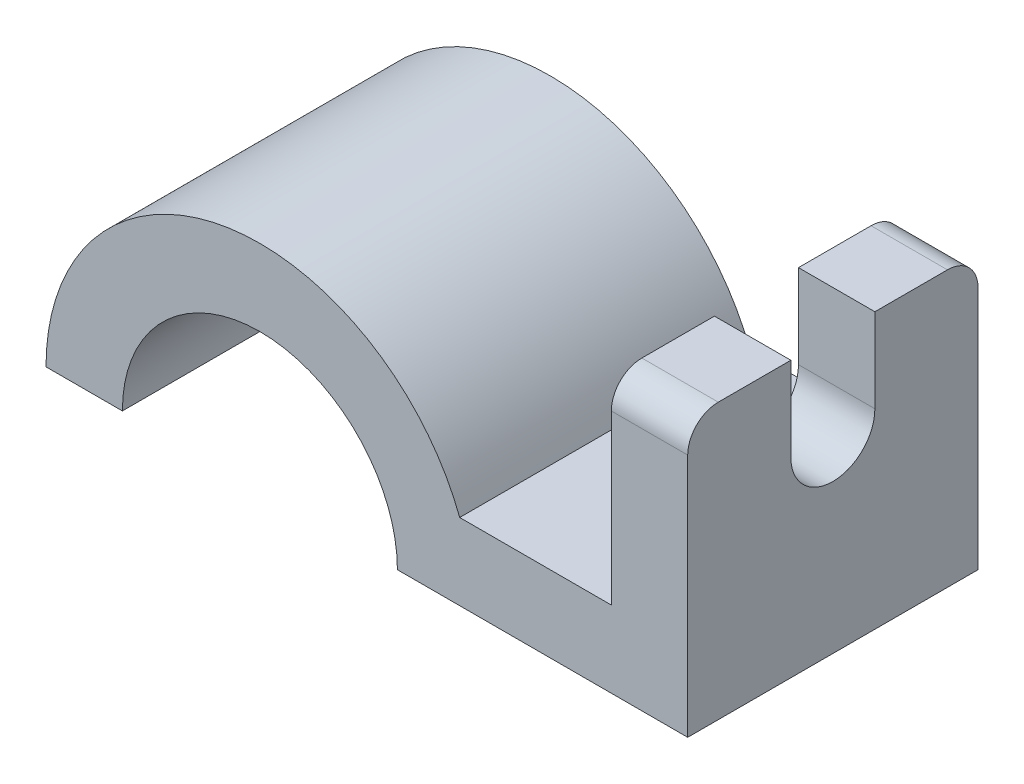
ISO-10303-21;
HEADER;
FILE_DESCRIPTION(('STEP AP214'),'2;1');
FILE_NAME('part.step','',(''),(''),'','','');
FILE_SCHEMA(('AUTOMOTIVE_DESIGN { 1 0 10303 214 1 1 1 1 }'));
ENDSEC;
DATA;
#1=APPLICATION_CONTEXT('core data for automotive mechanical design processes');
#2=APPLICATION_PROTOCOL_DEFINITION('international standard','automotive_design',2000,#1);
#3=PRODUCT_CONTEXT('',#1,'mechanical');
#4=PRODUCT('Part','Part','',(#3));
#5=PRODUCT_RELATED_PRODUCT_CATEGORY('part','',(#4));
#6=PRODUCT_DEFINITION_FORMATION('','',#4);
#7=PRODUCT_DEFINITION_CONTEXT('part definition',#1,'design');
#8=PRODUCT_DEFINITION('design','',#6,#7);
#9=PRODUCT_DEFINITION_SHAPE('','',#8);
#10=(LENGTH_UNIT() NAMED_UNIT(*) SI_UNIT(.MILLI.,.METRE.));
#11=(NAMED_UNIT(*) PLANE_ANGLE_UNIT() SI_UNIT($,.RADIAN.));
#12=(NAMED_UNIT(*) SI_UNIT($,.STERADIAN.) SOLID_ANGLE_UNIT());
#13=UNCERTAINTY_MEASURE_WITH_UNIT(LENGTH_MEASURE(1.E-05),#10,'distance_accuracy_value','');
#14=(GEOMETRIC_REPRESENTATION_CONTEXT(3) GLOBAL_UNCERTAINTY_ASSIGNED_CONTEXT((#13)) GLOBAL_UNIT_ASSIGNED_CONTEXT((#10,
#11,#12)) REPRESENTATION_CONTEXT('',''));
#15=CARTESIAN_POINT('',(0.,0.,0.));
#16=DIRECTION('',(0.,0.,1.));
#17=DIRECTION('',(1.,0.,0.));
#18=AXIS2_PLACEMENT_3D('',#15,#16,#17);
#19=CARTESIAN_POINT('',(0.,25.,-19.));
#20=DIRECTION('',(-1.,0.,0.));
#21=DIRECTION('',(0.,0.,1.));
#22=AXIS2_PLACEMENT_3D('',#19,#20,#21);
#23=PLANE('',#22);
#24=DIRECTION('',(0.,1.,0.));
#25=VECTOR('',#24,1.);
#26=CARTESIAN_POINT('',(0.,0.,-38.));
#27=LINE('',#26,#25);
#28=CARTESIAN_POINT('',(0.,10.,-38.));
#29=VERTEX_POINT('',#28);
#30=CARTESIAN_POINT('',(0.,32.,-38.));
#31=VERTEX_POINT('',#30);
#32=EDGE_CURVE('E181',#29,#31,#27,.T.);
#33=ORIENTED_EDGE('',*,*,#32,.F.);
#34=DIRECTION('',(0.,0.,1.));
#35=VECTOR('',#34,1.);
#36=CARTESIAN_POINT('',(0.,10.,-38.));
#37=LINE('',#36,#35);
#38=CARTESIAN_POINT('',(0.,10.,0.));
#39=VERTEX_POINT('',#38);
#40=EDGE_CURVE('E171',#29,#39,#37,.T.);
#41=ORIENTED_EDGE('',*,*,#40,.T.);
#42=DIRECTION('',(0.,-1.,0.));
#43=VECTOR('',#42,1.);
#44=CARTESIAN_POINT('',(0.,36.,0.));
#45=LINE('',#44,#43);
#46=CARTESIAN_POINT('',(0.,32.,0.));
#47=VERTEX_POINT('',#46);
#48=EDGE_CURVE('E170',#47,#39,#45,.T.);
#49=ORIENTED_EDGE('',*,*,#48,.F.);
#50=CARTESIAN_POINT('',(0.,32.,-4.));
#51=DIRECTION('',(-1.,0.,0.));
#52=DIRECTION('',(0.,0.,1.));
#53=AXIS2_PLACEMENT_3D('',#50,#51,#52);
#54=CIRCLE('',#53,4.);
#55=CARTESIAN_POINT('',(0.,36.,-4.));
#56=VERTEX_POINT('',#55);
#57=EDGE_CURVE('E229',#47,#56,#54,.T.);
#58=ORIENTED_EDGE('',*,*,#57,.T.);
#59=DIRECTION('',(0.,0.,1.));
#60=VECTOR('',#59,1.);
#61=CARTESIAN_POINT('',(0.,36.,-13.5));
#62=LINE('',#61,#60);
#63=CARTESIAN_POINT('',(0.,36.,-13.5));
#64=VERTEX_POINT('',#63);
#65=EDGE_CURVE('E206',#64,#56,#62,.T.);
#66=ORIENTED_EDGE('',*,*,#65,.F.);
#67=DIRECTION('',(0.,1.,0.));
#68=VECTOR('',#67,1.);
#69=CARTESIAN_POINT('',(0.,25.,-13.5));
#70=LINE('',#69,#68);
#71=CARTESIAN_POINT('',(0.,25.,-13.5));
#72=VERTEX_POINT('',#71);
#73=EDGE_CURVE('E204',#72,#64,#70,.T.);
#74=ORIENTED_EDGE('',*,*,#73,.F.);
#75=CARTESIAN_POINT('',(0.,25.,-19.));
#76=DIRECTION('',(-1.,0.,0.));
#77=DIRECTION('',(0.,0.,1.));
#78=AXIS2_PLACEMENT_3D('',#75,#76,#77);
#79=CIRCLE('',#78,5.5);
#80=CARTESIAN_POINT('',(0.,25.,-24.5));
#81=VERTEX_POINT('',#80);
#82=EDGE_CURVE('E202',#81,#72,#79,.T.);
#83=ORIENTED_EDGE('',*,*,#82,.F.);
#84=DIRECTION('',(0.,-1.,0.));
#85=VECTOR('',#84,1.);
#86=CARTESIAN_POINT('',(0.,36.,-24.5));
#87=LINE('',#86,#85);
#88=CARTESIAN_POINT('',(0.,36.,-24.5));
#89=VERTEX_POINT('',#88);
#90=EDGE_CURVE('E191',#89,#81,#87,.T.);
#91=ORIENTED_EDGE('',*,*,#90,.F.);
#92=DIRECTION('',(0.,0.,1.));
#93=VECTOR('',#92,1.);
#94=CARTESIAN_POINT('',(0.,36.,-38.));
#95=LINE('',#94,#93);
#96=CARTESIAN_POINT('',(0.,36.,-34.));
#97=VERTEX_POINT('',#96);
#98=EDGE_CURVE('E189',#97,#89,#95,.T.);
#99=ORIENTED_EDGE('',*,*,#98,.F.);
#100=CARTESIAN_POINT('',(0.,32.,-34.));
#101=DIRECTION('',(-1.,0.,0.));
#102=DIRECTION('',(0.,0.,1.));
#103=AXIS2_PLACEMENT_3D('',#100,#101,#102);
#104=CIRCLE('',#103,4.);
#105=EDGE_CURVE('E187',#97,#31,#104,.T.);
#106=ORIENTED_EDGE('',*,*,#105,.T.);
#107=EDGE_LOOP('',(#33,#41,#49,#58,#66,#74,#83,#91,#99,#106));
#108=FACE_BOUND('',#107,.T.);
#109=ADVANCED_FACE('F31',(#108),#23,.T.);
#110=CARTESIAN_POINT('',(10.,36.,0.));
#111=DIRECTION('',(0.,0.,-1.));
#112=DIRECTION('',(0.,1.,0.));
#113=AXIS2_PLACEMENT_3D('',#110,#111,#112);
#114=PLANE('',#113);
#115=DIRECTION('',(0.,-1.,0.));
#116=VECTOR('',#115,1.);
#117=CARTESIAN_POINT('',(10.,36.,0.));
#118=LINE('',#117,#116);
#119=CARTESIAN_POINT('',(10.,32.,0.));
#120=VERTEX_POINT('',#119);
#121=CARTESIAN_POINT('',(10.,0.,0.));
#122=VERTEX_POINT('',#121);
#123=EDGE_CURVE('E208',#120,#122,#118,.T.);
#124=ORIENTED_EDGE('',*,*,#123,.F.);
#125=DIRECTION('',(-1.,0.,0.));
#126=VECTOR('',#125,1.);
#127=CARTESIAN_POINT('',(10.,32.,0.));
#128=LINE('',#127,#126);
#129=EDGE_CURVE('E40',#120,#47,#128,.T.);
#130=ORIENTED_EDGE('',*,*,#129,.T.);
#131=ORIENTED_EDGE('',*,*,#48,.T.);
#132=DIRECTION('',(-1.,0.,0.));
#133=VECTOR('',#132,1.);
#134=CARTESIAN_POINT('',(0.,10.,0.));
#135=LINE('',#134,#133);
#136=CARTESIAN_POINT('',(-19.846606338756,10.,0.));
#137=VERTEX_POINT('',#136);
#138=EDGE_CURVE('E48',#39,#137,#135,.T.);
#139=ORIENTED_EDGE('',*,*,#138,.T.);
#140=CARTESIAN_POINT('',(-46.,0.,0.));
#141=DIRECTION('',(0.,0.,1.));
#142=DIRECTION('',(1.,0.,0.));
#143=AXIS2_PLACEMENT_3D('',#140,#141,#142);
#144=CIRCLE('',#143,28.);
#145=CARTESIAN_POINT('',(-74.,0.,0.));
#146=VERTEX_POINT('',#145);
#147=EDGE_CURVE('E164',#137,#146,#144,.T.);
#148=ORIENTED_EDGE('',*,*,#147,.T.);
#149=DIRECTION('',(1.,0.,0.));
#150=VECTOR('',#149,1.);
#151=CARTESIAN_POINT('',(-64.,0.,0.));
#152=LINE('',#151,#150);
#153=CARTESIAN_POINT('',(-64.,0.,0.));
#154=VERTEX_POINT('',#153);
#155=EDGE_CURVE('E139',#146,#154,#152,.T.);
#156=ORIENTED_EDGE('',*,*,#155,.T.);
#157=CARTESIAN_POINT('',(-46.,0.,0.));
#158=DIRECTION('',(0.,0.,-1.));
#159=DIRECTION('',(1.,0.,0.));
#160=AXIS2_PLACEMENT_3D('',#157,#158,#159);
#161=CIRCLE('',#160,18.);
#162=CARTESIAN_POINT('',(-28.,0.,0.));
#163=VERTEX_POINT('',#162);
#164=EDGE_CURVE('E160',#154,#163,#161,.T.);
#165=ORIENTED_EDGE('',*,*,#164,.T.);
#166=DIRECTION('',(-1.,0.,0.));
#167=VECTOR('',#166,1.);
#168=CARTESIAN_POINT('',(10.,0.,0.));
#169=LINE('',#168,#167);
#170=EDGE_CURVE('E224',#122,#163,#169,.T.);
#171=ORIENTED_EDGE('',*,*,#170,.F.);
#172=EDGE_LOOP('',(#124,#130,#131,#139,#148,#156,#165,#171));
#173=FACE_BOUND('',#172,.T.);
#174=ADVANCED_FACE('F241',(#173),#114,.F.);
#175=CARTESIAN_POINT('',(10.,0.,0.));
#176=DIRECTION('',(0.,1.,0.));
#177=DIRECTION('',(0.,0.,1.));
#178=AXIS2_PLACEMENT_3D('',#175,#176,#177);
#179=PLANE('',#178);
#180=ORIENTED_EDGE('',*,*,#170,.T.);
#181=DIRECTION('',(0.,0.,1.));
#182=VECTOR('',#181,1.);
#183=CARTESIAN_POINT('',(-28.,0.,-38.));
#184=LINE('',#183,#182);
#185=CARTESIAN_POINT('',(-28.,0.,-38.));
#186=VERTEX_POINT('',#185);
#187=EDGE_CURVE('E174',#186,#163,#184,.T.);
#188=ORIENTED_EDGE('',*,*,#187,.F.);
#189=DIRECTION('',(-1.,0.,0.));
#190=VECTOR('',#189,1.);
#191=CARTESIAN_POINT('',(10.,0.,-38.));
#192=LINE('',#191,#190);
#193=CARTESIAN_POINT('',(10.,0.,-38.));
#194=VERTEX_POINT('',#193);
#195=EDGE_CURVE('E222',#194,#186,#192,.T.);
#196=ORIENTED_EDGE('',*,*,#195,.F.);
#197=DIRECTION('',(0.,0.,-1.));
#198=VECTOR('',#197,1.);
#199=CARTESIAN_POINT('',(10.,0.,0.));
#200=LINE('',#199,#198);
#201=EDGE_CURVE('E265',#122,#194,#200,.T.);
#202=ORIENTED_EDGE('',*,*,#201,.F.);
#203=EDGE_LOOP('',(#180,#188,#196,#202));
#204=FACE_BOUND('',#203,.T.);
#205=ADVANCED_FACE('F274',(#204),#179,.F.);
#206=CARTESIAN_POINT('',(10.,0.,-38.));
#207=DIRECTION('',(0.,0.,1.));
#208=DIRECTION('',(1.,0.,0.));
#209=AXIS2_PLACEMENT_3D('',#206,#207,#208);
#210=PLANE('',#209);
#211=ORIENTED_EDGE('',*,*,#195,.T.);
#212=CARTESIAN_POINT('',(-46.,0.,-38.));
#213=DIRECTION('',(0.,0.,-1.));
#214=DIRECTION('',(1.,0.,0.));
#215=AXIS2_PLACEMENT_3D('',#212,#213,#214);
#216=CIRCLE('',#215,18.);
#217=CARTESIAN_POINT('',(-64.,0.,-38.));
#218=VERTEX_POINT('',#217);
#219=EDGE_CURVE('E155',#218,#186,#216,.T.);
#220=ORIENTED_EDGE('',*,*,#219,.F.);
#221=DIRECTION('',(1.,0.,0.));
#222=VECTOR('',#221,1.);
#223=CARTESIAN_POINT('',(-64.,0.,-38.));
#224=LINE('',#223,#222);
#225=CARTESIAN_POINT('',(-74.,0.,-38.));
#226=VERTEX_POINT('',#225);
#227=EDGE_CURVE('E137',#226,#218,#224,.T.);
#228=ORIENTED_EDGE('',*,*,#227,.F.);
#229=CARTESIAN_POINT('',(-46.,0.,-38.));
#230=DIRECTION('',(0.,0.,1.));
#231=DIRECTION('',(1.,0.,0.));
#232=AXIS2_PLACEMENT_3D('',#229,#230,#231);
#233=CIRCLE('',#232,28.);
#234=CARTESIAN_POINT('',(-19.846606338756,10.,-38.));
#235=VERTEX_POINT('',#234);
#236=EDGE_CURVE('E152',#235,#226,#233,.T.);
#237=ORIENTED_EDGE('',*,*,#236,.F.);
#238=DIRECTION('',(-1.,0.,0.));
#239=VECTOR('',#238,1.);
#240=CARTESIAN_POINT('',(0.,10.,-38.));
#241=LINE('',#240,#239);
#242=EDGE_CURVE('E145',#29,#235,#241,.T.);
#243=ORIENTED_EDGE('',*,*,#242,.F.);
#244=ORIENTED_EDGE('',*,*,#32,.T.);
#245=DIRECTION('',(-1.,0.,0.));
#246=VECTOR('',#245,1.);
#247=CARTESIAN_POINT('',(10.,32.,-38.));
#248=LINE('',#247,#246);
#249=CARTESIAN_POINT('',(10.,32.,-38.));
#250=VERTEX_POINT('',#249);
#251=EDGE_CURVE('E232',#31,#250,#248,.F.);
#252=ORIENTED_EDGE('',*,*,#251,.T.);
#253=DIRECTION('',(0.,1.,0.));
#254=VECTOR('',#253,1.);
#255=CARTESIAN_POINT('',(10.,0.,-38.));
#256=LINE('',#255,#254);
#257=EDGE_CURVE('E263',#194,#250,#256,.T.);
#258=ORIENTED_EDGE('',*,*,#257,.F.);
#259=EDGE_LOOP('',(#211,#220,#228,#237,#243,#244,#252,#258));
#260=FACE_BOUND('',#259,.T.);
#261=ADVANCED_FACE('F150',(#260),#210,.F.);
#262=CARTESIAN_POINT('',(10.,36.,-38.));
#263=DIRECTION('',(0.,-1.,0.));
#264=DIRECTION('',(0.,0.,-1.));
#265=AXIS2_PLACEMENT_3D('',#262,#263,#264);
#266=PLANE('',#265);
#267=DIRECTION('',(0.,0.,1.));
#268=VECTOR('',#267,1.);
#269=CARTESIAN_POINT('',(10.,36.,-38.));
#270=LINE('',#269,#268);
#271=CARTESIAN_POINT('',(10.,36.,-34.));
#272=VERTEX_POINT('',#271);
#273=CARTESIAN_POINT('',(10.,36.,-24.5));
#274=VERTEX_POINT('',#273);
#275=EDGE_CURVE('E261',#272,#274,#270,.T.);
#276=ORIENTED_EDGE('',*,*,#275,.F.);
#277=DIRECTION('',(-1.,0.,0.));
#278=VECTOR('',#277,1.);
#279=CARTESIAN_POINT('',(10.,36.,-34.));
#280=LINE('',#279,#278);
#281=EDGE_CURVE('E226',#272,#97,#280,.T.);
#282=ORIENTED_EDGE('',*,*,#281,.T.);
#283=ORIENTED_EDGE('',*,*,#98,.T.);
#284=DIRECTION('',(-1.,0.,0.));
#285=VECTOR('',#284,1.);
#286=CARTESIAN_POINT('',(10.,36.,-24.5));
#287=LINE('',#286,#285);
#288=EDGE_CURVE('E219',#274,#89,#287,.T.);
#289=ORIENTED_EDGE('',*,*,#288,.F.);
#290=EDGE_LOOP('',(#276,#282,#283,#289));
#291=FACE_BOUND('',#290,.T.);
#292=ADVANCED_FACE('F282',(#291),#266,.F.);
#293=CARTESIAN_POINT('',(10.,36.,-24.5));
#294=DIRECTION('',(0.,0.,-1.));
#295=DIRECTION('',(0.,1.,0.));
#296=AXIS2_PLACEMENT_3D('',#293,#294,#295);
#297=PLANE('',#296);
#298=ORIENTED_EDGE('',*,*,#90,.T.);
#299=DIRECTION('',(-1.,0.,0.));
#300=VECTOR('',#299,1.);
#301=CARTESIAN_POINT('',(10.,25.,-24.5));
#302=LINE('',#301,#300);
#303=CARTESIAN_POINT('',(10.,25.,-24.5));
#304=VERTEX_POINT('',#303);
#305=EDGE_CURVE('E216',#304,#81,#302,.T.);
#306=ORIENTED_EDGE('',*,*,#305,.F.);
#307=DIRECTION('',(0.,-1.,0.));
#308=VECTOR('',#307,1.);
#309=CARTESIAN_POINT('',(10.,36.,-24.5));
#310=LINE('',#309,#308);
#311=EDGE_CURVE('E259',#274,#304,#310,.T.);
#312=ORIENTED_EDGE('',*,*,#311,.F.);
#313=ORIENTED_EDGE('',*,*,#288,.T.);
#314=EDGE_LOOP('',(#298,#306,#312,#313));
#315=FACE_BOUND('',#314,.T.);
#316=ADVANCED_FACE('F288',(#315),#297,.F.);
#317=CARTESIAN_POINT('',(10.,25.,-19.));
#318=DIRECTION('',(-1.,0.,0.));
#319=DIRECTION('',(0.,0.,1.));
#320=AXIS2_PLACEMENT_3D('',#317,#318,#319);
#321=CYLINDRICAL_SURFACE('',#320,5.5);
#322=ORIENTED_EDGE('',*,*,#82,.T.);
#323=DIRECTION('',(-1.,0.,0.));
#324=VECTOR('',#323,1.);
#325=CARTESIAN_POINT('',(10.,25.,-13.5));
#326=LINE('',#325,#324);
#327=CARTESIAN_POINT('',(10.,25.,-13.5));
#328=VERTEX_POINT('',#327);
#329=EDGE_CURVE('E212',#328,#72,#326,.T.);
#330=ORIENTED_EDGE('',*,*,#329,.F.);
#331=CARTESIAN_POINT('',(10.,25.,-19.));
#332=DIRECTION('',(-1.,0.,0.));
#333=DIRECTION('',(0.,0.,1.));
#334=AXIS2_PLACEMENT_3D('',#331,#332,#333);
#335=CIRCLE('',#334,5.5);
#336=EDGE_CURVE('E255',#304,#328,#335,.T.);
#337=ORIENTED_EDGE('',*,*,#336,.F.);
#338=ORIENTED_EDGE('',*,*,#305,.T.);
#339=EDGE_LOOP('',(#322,#330,#337,#338));
#340=FACE_BOUND('',#339,.T.);
#341=ADVANCED_FACE('F292',(#340),#321,.F.);
#342=CARTESIAN_POINT('',(10.,25.,-13.5));
#343=DIRECTION('',(0.,0.,1.));
#344=DIRECTION('',(1.,0.,0.));
#345=AXIS2_PLACEMENT_3D('',#342,#343,#344);
#346=PLANE('',#345);
#347=ORIENTED_EDGE('',*,*,#73,.T.);
#348=DIRECTION('',(-1.,0.,0.));
#349=VECTOR('',#348,1.);
#350=CARTESIAN_POINT('',(10.,36.,-13.5));
#351=LINE('',#350,#349);
#352=CARTESIAN_POINT('',(10.,36.,-13.5));
#353=VERTEX_POINT('',#352);
#354=EDGE_CURVE('E209',#353,#64,#351,.T.);
#355=ORIENTED_EDGE('',*,*,#354,.F.);
#356=DIRECTION('',(0.,1.,0.));
#357=VECTOR('',#356,1.);
#358=CARTESIAN_POINT('',(10.,25.,-13.5));
#359=LINE('',#358,#357);
#360=EDGE_CURVE('E254',#328,#353,#359,.T.);
#361=ORIENTED_EDGE('',*,*,#360,.F.);
#362=ORIENTED_EDGE('',*,*,#329,.T.);
#363=EDGE_LOOP('',(#347,#355,#361,#362));
#364=FACE_BOUND('',#363,.T.);
#365=ADVANCED_FACE('F295',(#364),#346,.F.);
#366=CARTESIAN_POINT('',(10.,36.,-13.5));
#367=DIRECTION('',(0.,-1.,0.));
#368=DIRECTION('',(0.,0.,-1.));
#369=AXIS2_PLACEMENT_3D('',#366,#367,#368);
#370=PLANE('',#369);
#371=ORIENTED_EDGE('',*,*,#65,.T.);
#372=DIRECTION('',(-1.,0.,0.));
#373=VECTOR('',#372,1.);
#374=CARTESIAN_POINT('',(10.,36.,-4.));
#375=LINE('',#374,#373);
#376=CARTESIAN_POINT('',(10.,36.,-4.));
#377=VERTEX_POINT('',#376);
#378=EDGE_CURVE('E11',#56,#377,#375,.F.);
#379=ORIENTED_EDGE('',*,*,#378,.T.);
#380=DIRECTION('',(0.,0.,1.));
#381=VECTOR('',#380,1.);
#382=CARTESIAN_POINT('',(10.,36.,-13.5));
#383=LINE('',#382,#381);
#384=EDGE_CURVE('E213',#353,#377,#383,.T.);
#385=ORIENTED_EDGE('',*,*,#384,.F.);
#386=ORIENTED_EDGE('',*,*,#354,.T.);
#387=EDGE_LOOP('',(#371,#379,#385,#386));
#388=FACE_BOUND('',#387,.T.);
#389=ADVANCED_FACE('F247',(#388),#370,.F.);
#390=CARTESIAN_POINT('',(10.,25.,-19.));
#391=DIRECTION('',(-1.,0.,0.));
#392=DIRECTION('',(0.,0.,1.));
#393=AXIS2_PLACEMENT_3D('',#390,#391,#392);
#394=PLANE('',#393);
#395=ORIENTED_EDGE('',*,*,#257,.T.);
#396=CARTESIAN_POINT('',(10.,32.,-34.));
#397=DIRECTION('',(-1.,0.,0.));
#398=DIRECTION('',(0.,0.,1.));
#399=AXIS2_PLACEMENT_3D('',#396,#397,#398);
#400=CIRCLE('',#399,4.);
#401=EDGE_CURVE('E236',#250,#272,#400,.F.);
#402=ORIENTED_EDGE('',*,*,#401,.T.);
#403=ORIENTED_EDGE('',*,*,#275,.T.);
#404=ORIENTED_EDGE('',*,*,#311,.T.);
#405=ORIENTED_EDGE('',*,*,#336,.T.);
#406=ORIENTED_EDGE('',*,*,#360,.T.);
#407=ORIENTED_EDGE('',*,*,#384,.T.);
#408=CARTESIAN_POINT('',(10.,32.,-4.));
#409=DIRECTION('',(-1.,0.,0.));
#410=DIRECTION('',(0.,0.,1.));
#411=AXIS2_PLACEMENT_3D('',#408,#409,#410);
#412=CIRCLE('',#411,4.);
#413=EDGE_CURVE('E234',#377,#120,#412,.F.);
#414=ORIENTED_EDGE('',*,*,#413,.T.);
#415=ORIENTED_EDGE('',*,*,#123,.T.);
#416=ORIENTED_EDGE('',*,*,#201,.T.);
#417=EDGE_LOOP('',(#395,#402,#403,#404,#405,#406,#407,#414,#415,#416));
#418=FACE_BOUND('',#417,.T.);
#419=ADVANCED_FACE('F251',(#418),#394,.F.);
#420=CARTESIAN_POINT('',(10.,32.,-34.));
#421=DIRECTION('',(-1.,0.,0.));
#422=DIRECTION('',(0.,0.,1.));
#423=AXIS2_PLACEMENT_3D('',#420,#421,#422);
#424=CYLINDRICAL_SURFACE('',#423,4.);
#425=ORIENTED_EDGE('',*,*,#401,.F.);
#426=ORIENTED_EDGE('',*,*,#251,.F.);
#427=ORIENTED_EDGE('',*,*,#105,.F.);
#428=ORIENTED_EDGE('',*,*,#281,.F.);
#429=EDGE_LOOP('',(#425,#426,#427,#428));
#430=FACE_BOUND('',#429,.T.);
#431=ADVANCED_FACE('F280',(#430),#424,.T.);
#432=CARTESIAN_POINT('',(10.,32.,-4.));
#433=DIRECTION('',(-1.,0.,0.));
#434=DIRECTION('',(0.,0.,1.));
#435=AXIS2_PLACEMENT_3D('',#432,#433,#434);
#436=CYLINDRICAL_SURFACE('',#435,4.);
#437=ORIENTED_EDGE('',*,*,#413,.F.);
#438=ORIENTED_EDGE('',*,*,#378,.F.);
#439=ORIENTED_EDGE('',*,*,#57,.F.);
#440=ORIENTED_EDGE('',*,*,#129,.F.);
#441=EDGE_LOOP('',(#437,#438,#439,#440));
#442=FACE_BOUND('',#441,.T.);
#443=ADVANCED_FACE('F33',(#442),#436,.T.);
#444=CARTESIAN_POINT('',(-46.,0.,-38.));
#445=DIRECTION('',(0.,0.,1.));
#446=DIRECTION('',(1.,0.,0.));
#447=AXIS2_PLACEMENT_3D('',#444,#445,#446);
#448=CYLINDRICAL_SURFACE('',#447,28.);
#449=ORIENTED_EDGE('',*,*,#147,.F.);
#450=DIRECTION('',(0.,0.,1.));
#451=VECTOR('',#450,1.);
#452=CARTESIAN_POINT('',(-19.846606338756,10.,-38.));
#453=LINE('',#452,#451);
#454=EDGE_CURVE('E158',#235,#137,#453,.T.);
#455=ORIENTED_EDGE('',*,*,#454,.F.);
#456=ORIENTED_EDGE('',*,*,#236,.T.);
#457=DIRECTION('',(0.,0.,1.));
#458=VECTOR('',#457,1.);
#459=CARTESIAN_POINT('',(-74.,0.,-38.));
#460=LINE('',#459,#458);
#461=EDGE_CURVE('E134',#226,#146,#460,.T.);
#462=ORIENTED_EDGE('',*,*,#461,.T.);
#463=EDGE_LOOP('',(#449,#455,#456,#462));
#464=FACE_BOUND('',#463,.T.);
#465=ADVANCED_FACE('F157',(#464),#448,.T.);
#466=CARTESIAN_POINT('',(0.,10.,-38.));
#467=DIRECTION('',(0.,1.,0.));
#468=DIRECTION('',(-1.,0.,0.));
#469=AXIS2_PLACEMENT_3D('',#466,#467,#468);
#470=PLANE('',#469);
#471=ORIENTED_EDGE('',*,*,#138,.F.);
#472=ORIENTED_EDGE('',*,*,#40,.F.);
#473=ORIENTED_EDGE('',*,*,#242,.T.);
#474=ORIENTED_EDGE('',*,*,#454,.T.);
#475=EDGE_LOOP('',(#471,#472,#473,#474));
#476=FACE_BOUND('',#475,.T.);
#477=ADVANCED_FACE('F179',(#476),#470,.T.);
#478=CARTESIAN_POINT('',(-46.,0.,-38.));
#479=DIRECTION('',(0.,0.,1.));
#480=DIRECTION('',(1.,0.,0.));
#481=AXIS2_PLACEMENT_3D('',#478,#479,#480);
#482=CYLINDRICAL_SURFACE('',#481,18.);
#483=ORIENTED_EDGE('',*,*,#164,.F.);
#484=DIRECTION('',(0.,0.,1.));
#485=VECTOR('',#484,1.);
#486=CARTESIAN_POINT('',(-64.,0.,-38.));
#487=LINE('',#486,#485);
#488=EDGE_CURVE('E144',#218,#154,#487,.T.);
#489=ORIENTED_EDGE('',*,*,#488,.F.);
#490=ORIENTED_EDGE('',*,*,#219,.T.);
#491=ORIENTED_EDGE('',*,*,#187,.T.);
#492=EDGE_LOOP('',(#483,#489,#490,#491));
#493=FACE_BOUND('',#492,.T.);
#494=ADVANCED_FACE('F271',(#493),#482,.F.);
#495=CARTESIAN_POINT('',(-64.,0.,-38.));
#496=DIRECTION('',(0.,-1.,0.));
#497=DIRECTION('',(1.,0.,0.));
#498=AXIS2_PLACEMENT_3D('',#495,#496,#497);
#499=PLANE('',#498);
#500=ORIENTED_EDGE('',*,*,#155,.F.);
#501=ORIENTED_EDGE('',*,*,#461,.F.);
#502=ORIENTED_EDGE('',*,*,#227,.T.);
#503=ORIENTED_EDGE('',*,*,#488,.T.);
#504=EDGE_LOOP('',(#500,#501,#502,#503));
#505=FACE_BOUND('',#504,.T.);
#506=ADVANCED_FACE('F136',(#505),#499,.T.);
#507=CLOSED_SHELL('',(#109,#174,#205,#261,#292,#316,#341,#365,#389,#419,#431,#443,#465,#477,
#494,#506));
#508=MANIFOLD_SOLID_BREP('B2',#507);
#509=ADVANCED_BREP_SHAPE_REPRESENTATION('',(#18,#508),#14);
#510=SHAPE_DEFINITION_REPRESENTATION(#9,#509);
ENDSEC;
END-ISO-10303-21;
